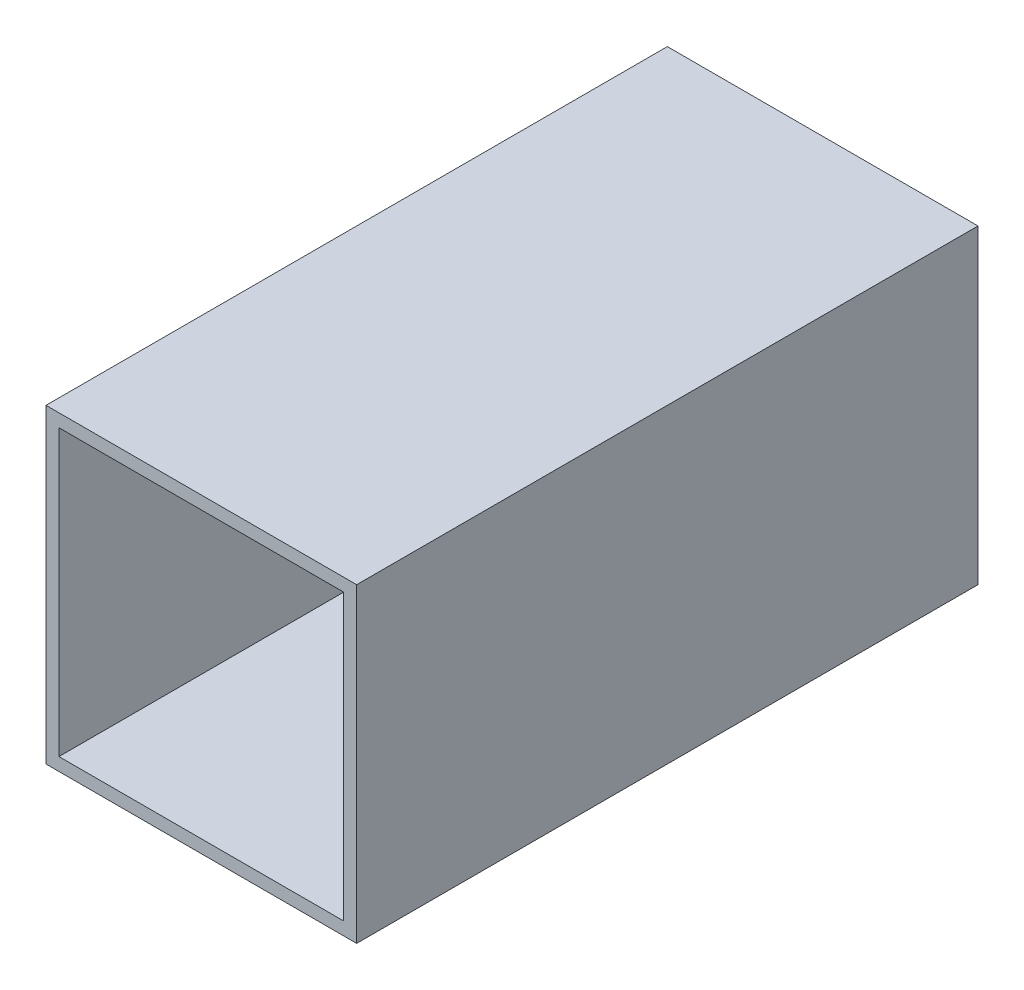
ISO-10303-21;
HEADER;
FILE_DESCRIPTION(('STEP AP214'),'2;1');
FILE_NAME('part.step','',(''),(''),'','','');
FILE_SCHEMA(('AUTOMOTIVE_DESIGN { 1 0 10303 214 1 1 1 1 }'));
ENDSEC;
DATA;
#1=APPLICATION_CONTEXT('core data for automotive mechanical design processes');
#2=APPLICATION_PROTOCOL_DEFINITION('international standard','automotive_design',2000,#1);
#3=PRODUCT_CONTEXT('',#1,'mechanical');
#4=PRODUCT('Part','Part','',(#3));
#5=PRODUCT_RELATED_PRODUCT_CATEGORY('part','',(#4));
#6=PRODUCT_DEFINITION_FORMATION('','',#4);
#7=PRODUCT_DEFINITION_CONTEXT('part definition',#1,'design');
#8=PRODUCT_DEFINITION('design','',#6,#7);
#9=PRODUCT_DEFINITION_SHAPE('','',#8);
#10=(LENGTH_UNIT() NAMED_UNIT(*) SI_UNIT(.MILLI.,.METRE.));
#11=(NAMED_UNIT(*) PLANE_ANGLE_UNIT() SI_UNIT($,.RADIAN.));
#12=(NAMED_UNIT(*) SI_UNIT($,.STERADIAN.) SOLID_ANGLE_UNIT());
#13=UNCERTAINTY_MEASURE_WITH_UNIT(LENGTH_MEASURE(1.E-05),#10,'distance_accuracy_value','');
#14=(GEOMETRIC_REPRESENTATION_CONTEXT(3) GLOBAL_UNCERTAINTY_ASSIGNED_CONTEXT((#13)) GLOBAL_UNIT_ASSIGNED_CONTEXT((#10,
#11,#12)) REPRESENTATION_CONTEXT('',''));
#15=CARTESIAN_POINT('',(0.,0.,0.));
#16=DIRECTION('',(0.,0.,1.));
#17=DIRECTION('',(1.,0.,0.));
#18=AXIS2_PLACEMENT_3D('',#15,#16,#17);
#19=CARTESIAN_POINT('',(0.,0.,76.2));
#20=DIRECTION('',(0.,0.,-1.));
#21=DIRECTION('',(-1.,0.,0.));
#22=AXIS2_PLACEMENT_3D('',#19,#20,#21);
#23=PLANE('',#22);
#24=DIRECTION('',(0.,1.,0.));
#25=VECTOR('',#24,1.);
#26=CARTESIAN_POINT('',(38.1,-38.1,76.2));
#27=LINE('',#26,#25);
#28=CARTESIAN_POINT('',(38.1,-38.1,76.2));
#29=VERTEX_POINT('',#28);
#30=CARTESIAN_POINT('',(38.1,38.1,76.2));
#31=VERTEX_POINT('',#30);
#32=EDGE_CURVE('E139',#29,#31,#27,.T.);
#33=ORIENTED_EDGE('',*,*,#32,.T.);
#34=DIRECTION('',(-1.,0.,0.));
#35=VECTOR('',#34,1.);
#36=CARTESIAN_POINT('',(-38.1,38.1,76.2));
#37=LINE('',#36,#35);
#38=CARTESIAN_POINT('',(-38.1,38.1,76.2));
#39=VERTEX_POINT('',#38);
#40=EDGE_CURVE('E142',#31,#39,#37,.T.);
#41=ORIENTED_EDGE('',*,*,#40,.T.);
#42=DIRECTION('',(0.,-1.,0.));
#43=VECTOR('',#42,1.);
#44=CARTESIAN_POINT('',(-38.1,-38.1,76.2));
#45=LINE('',#44,#43);
#46=CARTESIAN_POINT('',(-38.1,-38.1,76.2));
#47=VERTEX_POINT('',#46);
#48=EDGE_CURVE('E147',#39,#47,#45,.T.);
#49=ORIENTED_EDGE('',*,*,#48,.T.);
#50=DIRECTION('',(1.,0.,0.));
#51=VECTOR('',#50,1.);
#52=CARTESIAN_POINT('',(-38.1,-38.1,76.2));
#53=LINE('',#52,#51);
#54=EDGE_CURVE('E149',#47,#29,#53,.T.);
#55=ORIENTED_EDGE('',*,*,#54,.T.);
#56=EDGE_LOOP('',(#33,#41,#49,#55));
#57=FACE_BOUND('',#56,.T.);
#58=DIRECTION('',(0.,-1.,0.));
#59=VECTOR('',#58,1.);
#60=CARTESIAN_POINT('',(-34.925,-34.925,76.2));
#61=LINE('',#60,#59);
#62=CARTESIAN_POINT('',(-34.925,34.925,76.2));
#63=VERTEX_POINT('',#62);
#64=CARTESIAN_POINT('',(-34.925,-34.925,76.2));
#65=VERTEX_POINT('',#64);
#66=EDGE_CURVE('E101',#63,#65,#61,.T.);
#67=ORIENTED_EDGE('',*,*,#66,.F.);
#68=DIRECTION('',(-1.,0.,0.));
#69=VECTOR('',#68,1.);
#70=CARTESIAN_POINT('',(-34.925,34.925,76.2));
#71=LINE('',#70,#69);
#72=CARTESIAN_POINT('',(34.925,34.925,76.2));
#73=VERTEX_POINT('',#72);
#74=EDGE_CURVE('E128',#73,#63,#71,.T.);
#75=ORIENTED_EDGE('',*,*,#74,.F.);
#76=DIRECTION('',(0.,1.,0.));
#77=VECTOR('',#76,1.);
#78=CARTESIAN_POINT('',(34.925,-34.925,76.2));
#79=LINE('',#78,#77);
#80=CARTESIAN_POINT('',(34.925,-34.925,76.2));
#81=VERTEX_POINT('',#80);
#82=EDGE_CURVE('E125',#81,#73,#79,.T.);
#83=ORIENTED_EDGE('',*,*,#82,.F.);
#84=DIRECTION('',(1.,0.,0.));
#85=VECTOR('',#84,1.);
#86=CARTESIAN_POINT('',(-34.925,-34.925,76.2));
#87=LINE('',#86,#85);
#88=EDGE_CURVE('E115',#65,#81,#87,.T.);
#89=ORIENTED_EDGE('',*,*,#88,.F.);
#90=EDGE_LOOP('',(#67,#75,#83,#89));
#91=FACE_BOUND('',#90,.T.);
#92=ADVANCED_FACE('F39',(#57,#91),#23,.F.);
#93=CARTESIAN_POINT('',(0.,0.,-76.2));
#94=DIRECTION('',(0.,0.,-1.));
#95=DIRECTION('',(-1.,0.,0.));
#96=AXIS2_PLACEMENT_3D('',#93,#94,#95);
#97=PLANE('',#96);
#98=DIRECTION('',(0.,1.,0.));
#99=VECTOR('',#98,1.);
#100=CARTESIAN_POINT('',(38.1,-38.1,-76.2));
#101=LINE('',#100,#99);
#102=CARTESIAN_POINT('',(38.1,-38.1,-76.2));
#103=VERTEX_POINT('',#102);
#104=CARTESIAN_POINT('',(38.1,38.1,-76.2));
#105=VERTEX_POINT('',#104);
#106=EDGE_CURVE('E120',#103,#105,#101,.T.);
#107=ORIENTED_EDGE('',*,*,#106,.F.);
#108=DIRECTION('',(1.,0.,0.));
#109=VECTOR('',#108,1.);
#110=CARTESIAN_POINT('',(-38.1,-38.1,-76.2));
#111=LINE('',#110,#109);
#112=CARTESIAN_POINT('',(-38.1,-38.1,-76.2));
#113=VERTEX_POINT('',#112);
#114=EDGE_CURVE('E143',#113,#103,#111,.T.);
#115=ORIENTED_EDGE('',*,*,#114,.F.);
#116=DIRECTION('',(0.,-1.,0.));
#117=VECTOR('',#116,1.);
#118=CARTESIAN_POINT('',(-38.1,-38.1,-76.2));
#119=LINE('',#118,#117);
#120=CARTESIAN_POINT('',(-38.1,38.1,-76.2));
#121=VERTEX_POINT('',#120);
#122=EDGE_CURVE('E155',#121,#113,#119,.T.);
#123=ORIENTED_EDGE('',*,*,#122,.F.);
#124=DIRECTION('',(-1.,0.,0.));
#125=VECTOR('',#124,1.);
#126=CARTESIAN_POINT('',(-38.1,38.1,-76.2));
#127=LINE('',#126,#125);
#128=EDGE_CURVE('E154',#105,#121,#127,.T.);
#129=ORIENTED_EDGE('',*,*,#128,.F.);
#130=EDGE_LOOP('',(#107,#115,#123,#129));
#131=FACE_BOUND('',#130,.T.);
#132=DIRECTION('',(-1.,0.,0.));
#133=VECTOR('',#132,1.);
#134=CARTESIAN_POINT('',(-34.925,34.925,-76.2));
#135=LINE('',#134,#133);
#136=CARTESIAN_POINT('',(34.925,34.925,-76.2));
#137=VERTEX_POINT('',#136);
#138=CARTESIAN_POINT('',(-34.925,34.925,-76.2));
#139=VERTEX_POINT('',#138);
#140=EDGE_CURVE('E111',#137,#139,#135,.T.);
#141=ORIENTED_EDGE('',*,*,#140,.T.);
#142=DIRECTION('',(0.,-1.,0.));
#143=VECTOR('',#142,1.);
#144=CARTESIAN_POINT('',(-34.925,-34.925,-76.2));
#145=LINE('',#144,#143);
#146=CARTESIAN_POINT('',(-34.925,-34.925,-76.2));
#147=VERTEX_POINT('',#146);
#148=EDGE_CURVE('E62',#139,#147,#145,.T.);
#149=ORIENTED_EDGE('',*,*,#148,.T.);
#150=DIRECTION('',(1.,0.,0.));
#151=VECTOR('',#150,1.);
#152=CARTESIAN_POINT('',(-34.925,-34.925,-76.2));
#153=LINE('',#152,#151);
#154=CARTESIAN_POINT('',(34.925,-34.925,-76.2));
#155=VERTEX_POINT('',#154);
#156=EDGE_CURVE('E118',#147,#155,#153,.T.);
#157=ORIENTED_EDGE('',*,*,#156,.T.);
#158=DIRECTION('',(0.,1.,0.));
#159=VECTOR('',#158,1.);
#160=CARTESIAN_POINT('',(34.925,-34.925,-76.2));
#161=LINE('',#160,#159);
#162=EDGE_CURVE('E135',#155,#137,#161,.T.);
#163=ORIENTED_EDGE('',*,*,#162,.T.);
#164=EDGE_LOOP('',(#141,#149,#157,#163));
#165=FACE_BOUND('',#164,.T.);
#166=ADVANCED_FACE('F171',(#131,#165),#97,.T.);
#167=CARTESIAN_POINT('',(38.1,-38.1,76.2));
#168=DIRECTION('',(-1.,0.,0.));
#169=DIRECTION('',(0.,-1.,0.));
#170=AXIS2_PLACEMENT_3D('',#167,#168,#169);
#171=PLANE('',#170);
#172=ORIENTED_EDGE('',*,*,#106,.T.);
#173=DIRECTION('',(0.,0.,-1.));
#174=VECTOR('',#173,1.);
#175=CARTESIAN_POINT('',(38.1,38.1,76.2));
#176=LINE('',#175,#174);
#177=EDGE_CURVE('E11',#31,#105,#176,.T.);
#178=ORIENTED_EDGE('',*,*,#177,.F.);
#179=ORIENTED_EDGE('',*,*,#32,.F.);
#180=DIRECTION('',(0.,0.,-1.));
#181=VECTOR('',#180,1.);
#182=CARTESIAN_POINT('',(38.1,-38.1,76.2));
#183=LINE('',#182,#181);
#184=EDGE_CURVE('E148',#29,#103,#183,.T.);
#185=ORIENTED_EDGE('',*,*,#184,.T.);
#186=EDGE_LOOP('',(#172,#178,#179,#185));
#187=FACE_BOUND('',#186,.T.);
#188=ADVANCED_FACE('F41',(#187),#171,.F.);
#189=CARTESIAN_POINT('',(-38.1,38.1,76.2));
#190=DIRECTION('',(0.,-1.,0.));
#191=DIRECTION('',(1.,0.,0.));
#192=AXIS2_PLACEMENT_3D('',#189,#190,#191);
#193=PLANE('',#192);
#194=ORIENTED_EDGE('',*,*,#128,.T.);
#195=DIRECTION('',(0.,0.,-1.));
#196=VECTOR('',#195,1.);
#197=CARTESIAN_POINT('',(-38.1,38.1,76.2));
#198=LINE('',#197,#196);
#199=EDGE_CURVE('E50',#39,#121,#198,.T.);
#200=ORIENTED_EDGE('',*,*,#199,.F.);
#201=ORIENTED_EDGE('',*,*,#40,.F.);
#202=ORIENTED_EDGE('',*,*,#177,.T.);
#203=EDGE_LOOP('',(#194,#200,#201,#202));
#204=FACE_BOUND('',#203,.T.);
#205=ADVANCED_FACE('F183',(#204),#193,.F.);
#206=CARTESIAN_POINT('',(-38.1,-38.1,76.2));
#207=DIRECTION('',(1.,0.,0.));
#208=DIRECTION('',(0.,0.,-1.));
#209=AXIS2_PLACEMENT_3D('',#206,#207,#208);
#210=PLANE('',#209);
#211=ORIENTED_EDGE('',*,*,#122,.T.);
#212=DIRECTION('',(0.,0.,-1.));
#213=VECTOR('',#212,1.);
#214=CARTESIAN_POINT('',(-38.1,-38.1,76.2));
#215=LINE('',#214,#213);
#216=EDGE_CURVE('E158',#47,#113,#215,.T.);
#217=ORIENTED_EDGE('',*,*,#216,.F.);
#218=ORIENTED_EDGE('',*,*,#48,.F.);
#219=ORIENTED_EDGE('',*,*,#199,.T.);
#220=EDGE_LOOP('',(#211,#217,#218,#219));
#221=FACE_BOUND('',#220,.T.);
#222=ADVANCED_FACE('F167',(#221),#210,.F.);
#223=CARTESIAN_POINT('',(-38.1,-38.1,76.2));
#224=DIRECTION('',(0.,1.,0.));
#225=DIRECTION('',(0.,0.,1.));
#226=AXIS2_PLACEMENT_3D('',#223,#224,#225);
#227=PLANE('',#226);
#228=ORIENTED_EDGE('',*,*,#114,.T.);
#229=ORIENTED_EDGE('',*,*,#184,.F.);
#230=ORIENTED_EDGE('',*,*,#54,.F.);
#231=ORIENTED_EDGE('',*,*,#216,.T.);
#232=EDGE_LOOP('',(#228,#229,#230,#231));
#233=FACE_BOUND('',#232,.T.);
#234=ADVANCED_FACE('F180',(#233),#227,.F.);
#235=CARTESIAN_POINT('',(-34.925,-34.925,76.2));
#236=DIRECTION('',(1.,0.,0.));
#237=DIRECTION('',(0.,0.,-1.));
#238=AXIS2_PLACEMENT_3D('',#235,#236,#237);
#239=PLANE('',#238);
#240=ORIENTED_EDGE('',*,*,#148,.F.);
#241=DIRECTION('',(0.,0.,-1.));
#242=VECTOR('',#241,1.);
#243=CARTESIAN_POINT('',(-34.925,34.925,76.2));
#244=LINE('',#243,#242);
#245=EDGE_CURVE('E109',#63,#139,#244,.T.);
#246=ORIENTED_EDGE('',*,*,#245,.F.);
#247=ORIENTED_EDGE('',*,*,#66,.T.);
#248=DIRECTION('',(0.,0.,-1.));
#249=VECTOR('',#248,1.);
#250=CARTESIAN_POINT('',(-34.925,-34.925,76.2));
#251=LINE('',#250,#249);
#252=EDGE_CURVE('E107',#65,#147,#251,.T.);
#253=ORIENTED_EDGE('',*,*,#252,.T.);
#254=EDGE_LOOP('',(#240,#246,#247,#253));
#255=FACE_BOUND('',#254,.T.);
#256=ADVANCED_FACE('F106',(#255),#239,.T.);
#257=CARTESIAN_POINT('',(-34.925,-34.925,76.2));
#258=DIRECTION('',(0.,1.,0.));
#259=DIRECTION('',(0.,0.,1.));
#260=AXIS2_PLACEMENT_3D('',#257,#258,#259);
#261=PLANE('',#260);
#262=ORIENTED_EDGE('',*,*,#156,.F.);
#263=ORIENTED_EDGE('',*,*,#252,.F.);
#264=ORIENTED_EDGE('',*,*,#88,.T.);
#265=DIRECTION('',(0.,0.,-1.));
#266=VECTOR('',#265,1.);
#267=CARTESIAN_POINT('',(34.925,-34.925,76.2));
#268=LINE('',#267,#266);
#269=EDGE_CURVE('E123',#81,#155,#268,.T.);
#270=ORIENTED_EDGE('',*,*,#269,.T.);
#271=EDGE_LOOP('',(#262,#263,#264,#270));
#272=FACE_BOUND('',#271,.T.);
#273=ADVANCED_FACE('F116',(#272),#261,.T.);
#274=CARTESIAN_POINT('',(34.925,-34.925,76.2));
#275=DIRECTION('',(-1.,0.,0.));
#276=DIRECTION('',(0.,0.,1.));
#277=AXIS2_PLACEMENT_3D('',#274,#275,#276);
#278=PLANE('',#277);
#279=ORIENTED_EDGE('',*,*,#162,.F.);
#280=ORIENTED_EDGE('',*,*,#269,.F.);
#281=ORIENTED_EDGE('',*,*,#82,.T.);
#282=DIRECTION('',(0.,0.,-1.));
#283=VECTOR('',#282,1.);
#284=CARTESIAN_POINT('',(34.925,34.925,76.2));
#285=LINE('',#284,#283);
#286=EDGE_CURVE('E53',#73,#137,#285,.T.);
#287=ORIENTED_EDGE('',*,*,#286,.T.);
#288=EDGE_LOOP('',(#279,#280,#281,#287));
#289=FACE_BOUND('',#288,.T.);
#290=ADVANCED_FACE('F206',(#289),#278,.T.);
#291=CARTESIAN_POINT('',(-34.925,34.925,76.2));
#292=DIRECTION('',(0.,-1.,0.));
#293=DIRECTION('',(0.,0.,-1.));
#294=AXIS2_PLACEMENT_3D('',#291,#292,#293);
#295=PLANE('',#294);
#296=ORIENTED_EDGE('',*,*,#140,.F.);
#297=ORIENTED_EDGE('',*,*,#286,.F.);
#298=ORIENTED_EDGE('',*,*,#74,.T.);
#299=ORIENTED_EDGE('',*,*,#245,.T.);
#300=EDGE_LOOP('',(#296,#297,#298,#299));
#301=FACE_BOUND('',#300,.T.);
#302=ADVANCED_FACE('F210',(#301),#295,.T.);
#303=CLOSED_SHELL('',(#92,#166,#188,#205,#222,#234,#256,#273,#290,#302));
#304=MANIFOLD_SOLID_BREP('B2',#303);
#305=ADVANCED_BREP_SHAPE_REPRESENTATION('',(#18,#304),#14);
#306=SHAPE_DEFINITION_REPRESENTATION(#9,#305);
ENDSEC;
END-ISO-10303-21;
